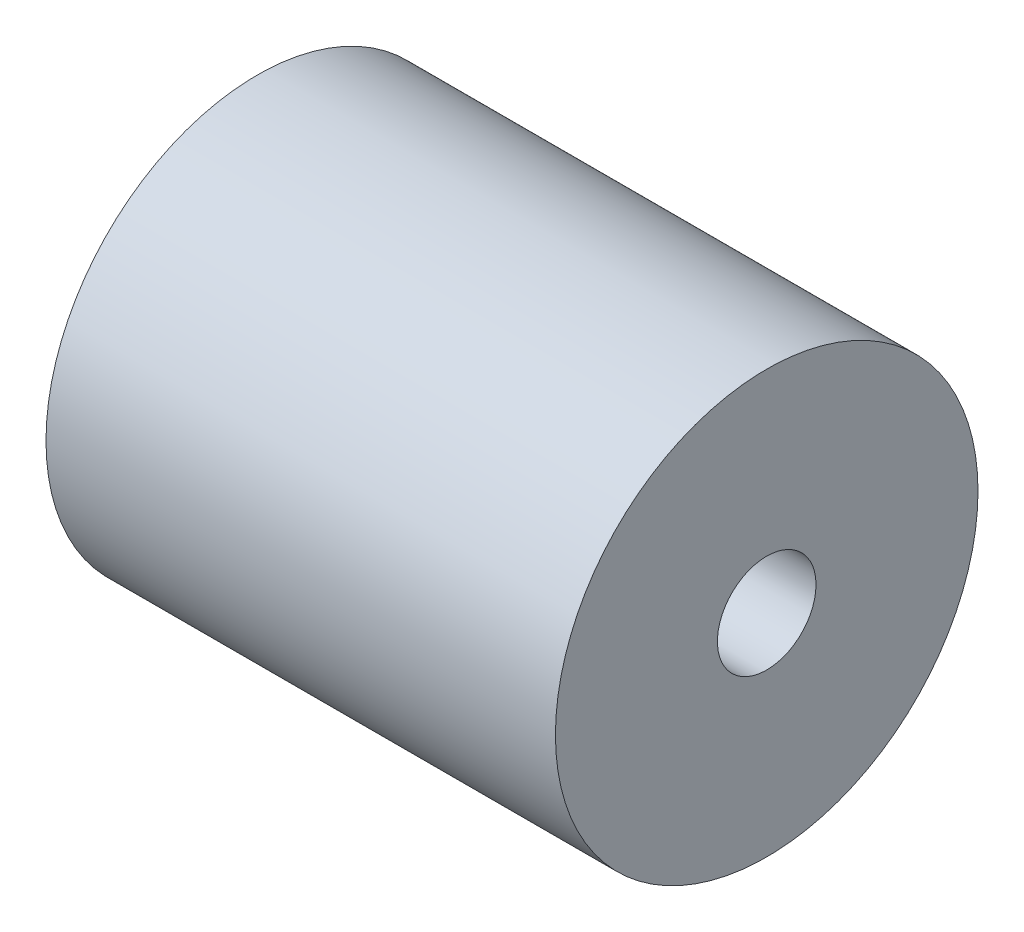
ISO-10303-21;
HEADER;
FILE_DESCRIPTION(('STEP AP214'),'2;1');
FILE_NAME('part.step','',(''),(''),'','','');
FILE_SCHEMA(('AUTOMOTIVE_DESIGN { 1 0 10303 214 1 1 1 1 }'));
ENDSEC;
DATA;
#1=APPLICATION_CONTEXT('core data for automotive mechanical design processes');
#2=APPLICATION_PROTOCOL_DEFINITION('international standard','automotive_design',2000,#1);
#3=PRODUCT_CONTEXT('',#1,'mechanical');
#4=PRODUCT('Part','Part','',(#3));
#5=PRODUCT_RELATED_PRODUCT_CATEGORY('part','',(#4));
#6=PRODUCT_DEFINITION_FORMATION('','',#4);
#7=PRODUCT_DEFINITION_CONTEXT('part definition',#1,'design');
#8=PRODUCT_DEFINITION('design','',#6,#7);
#9=PRODUCT_DEFINITION_SHAPE('','',#8);
#10=(LENGTH_UNIT() NAMED_UNIT(*) SI_UNIT(.MILLI.,.METRE.));
#11=(NAMED_UNIT(*) PLANE_ANGLE_UNIT() SI_UNIT($,.RADIAN.));
#12=(NAMED_UNIT(*) SI_UNIT($,.STERADIAN.) SOLID_ANGLE_UNIT());
#13=UNCERTAINTY_MEASURE_WITH_UNIT(LENGTH_MEASURE(1.E-05),#10,'distance_accuracy_value','');
#14=(GEOMETRIC_REPRESENTATION_CONTEXT(3) GLOBAL_UNCERTAINTY_ASSIGNED_CONTEXT((#13)) GLOBAL_UNIT_ASSIGNED_CONTEXT((#10,
#11,#12)) REPRESENTATION_CONTEXT('',''));
#15=CARTESIAN_POINT('',(0.,0.,0.));
#16=DIRECTION('',(0.,0.,1.));
#17=DIRECTION('',(1.,0.,0.));
#18=AXIS2_PLACEMENT_3D('',#15,#16,#17);
#19=CARTESIAN_POINT('',(21.7,0.,0.));
#20=DIRECTION('',(1.,0.,0.));
#21=DIRECTION('',(0.,0.,-1.));
#22=AXIS2_PLACEMENT_3D('',#19,#20,#21);
#23=PLANE('',#22);
#24=CARTESIAN_POINT('',(21.7,0.,0.));
#25=DIRECTION('',(1.,0.,0.));
#26=DIRECTION('',(0.,0.,-1.));
#27=AXIS2_PLACEMENT_3D('',#24,#25,#26);
#28=CIRCLE('',#27,9.);
#29=CARTESIAN_POINT('',(21.7,0.,-9.));
#30=VERTEX_POINT('',#29);
#31=EDGE_CURVE('E10',#30,#30,#28,.T.);
#32=ORIENTED_EDGE('',*,*,#31,.T.);
#33=EDGE_LOOP('',(#32));
#34=FACE_BOUND('',#33,.T.);
#35=CARTESIAN_POINT('',(21.7,0.,0.));
#36=DIRECTION('',(1.,0.,0.));
#37=DIRECTION('',(0.,0.,-1.));
#38=AXIS2_PLACEMENT_3D('',#35,#36,#37);
#39=CIRCLE('',#38,2.1);
#40=CARTESIAN_POINT('',(21.7,0.,-2.1));
#41=VERTEX_POINT('',#40);
#42=EDGE_CURVE('E46',#41,#41,#39,.T.);
#43=ORIENTED_EDGE('',*,*,#42,.F.);
#44=EDGE_LOOP('',(#43));
#45=FACE_BOUND('',#44,.T.);
#46=ADVANCED_FACE('F35',(#34,#45),#23,.T.);
#47=CARTESIAN_POINT('',(0.,0.,0.));
#48=DIRECTION('',(1.,0.,0.));
#49=DIRECTION('',(0.,0.,-1.));
#50=AXIS2_PLACEMENT_3D('',#47,#48,#49);
#51=PLANE('',#50);
#52=CARTESIAN_POINT('',(0.,0.,0.));
#53=DIRECTION('',(1.,0.,0.));
#54=DIRECTION('',(0.,0.,-1.));
#55=AXIS2_PLACEMENT_3D('',#52,#53,#54);
#56=CIRCLE('',#55,9.);
#57=CARTESIAN_POINT('',(0.,0.,-9.));
#58=VERTEX_POINT('',#57);
#59=EDGE_CURVE('E39',#58,#58,#56,.T.);
#60=ORIENTED_EDGE('',*,*,#59,.F.);
#61=EDGE_LOOP('',(#60));
#62=FACE_BOUND('',#61,.T.);
#63=CARTESIAN_POINT('',(0.,0.,0.));
#64=DIRECTION('',(1.,0.,0.));
#65=DIRECTION('',(0.,0.,-1.));
#66=AXIS2_PLACEMENT_3D('',#63,#64,#65);
#67=CIRCLE('',#66,2.1);
#68=CARTESIAN_POINT('',(0.,0.,-2.1));
#69=VERTEX_POINT('',#68);
#70=EDGE_CURVE('E48',#69,#69,#67,.T.);
#71=ORIENTED_EDGE('',*,*,#70,.T.);
#72=EDGE_LOOP('',(#71));
#73=FACE_BOUND('',#72,.T.);
#74=ADVANCED_FACE('F58',(#62,#73),#51,.F.);
#75=CARTESIAN_POINT('',(21.7,0.,0.));
#76=DIRECTION('',(-1.,0.,0.));
#77=DIRECTION('',(0.,0.,1.));
#78=AXIS2_PLACEMENT_3D('',#75,#76,#77);
#79=CYLINDRICAL_SURFACE('',#78,9.);
#80=ORIENTED_EDGE('',*,*,#31,.F.);
#81=EDGE_LOOP('',(#80));
#82=FACE_BOUND('',#81,.T.);
#83=ORIENTED_EDGE('',*,*,#59,.T.);
#84=EDGE_LOOP('',(#83));
#85=FACE_BOUND('',#84,.T.);
#86=ADVANCED_FACE('F37',(#82,#85),#79,.T.);
#87=CARTESIAN_POINT('',(21.7,0.,0.));
#88=DIRECTION('',(-1.,0.,0.));
#89=DIRECTION('',(0.,0.,1.));
#90=AXIS2_PLACEMENT_3D('',#87,#88,#89);
#91=CYLINDRICAL_SURFACE('',#90,2.1);
#92=ORIENTED_EDGE('',*,*,#42,.T.);
#93=EDGE_LOOP('',(#92));
#94=FACE_BOUND('',#93,.T.);
#95=ORIENTED_EDGE('',*,*,#70,.F.);
#96=EDGE_LOOP('',(#95));
#97=FACE_BOUND('',#96,.T.);
#98=ADVANCED_FACE('F54',(#94,#97),#91,.F.);
#99=CLOSED_SHELL('',(#46,#74,#86,#98));
#100=MANIFOLD_SOLID_BREP('B2',#99);
#101=ADVANCED_BREP_SHAPE_REPRESENTATION('',(#18,#100),#14);
#102=SHAPE_DEFINITION_REPRESENTATION(#9,#101);
ENDSEC;
END-ISO-10303-21;
